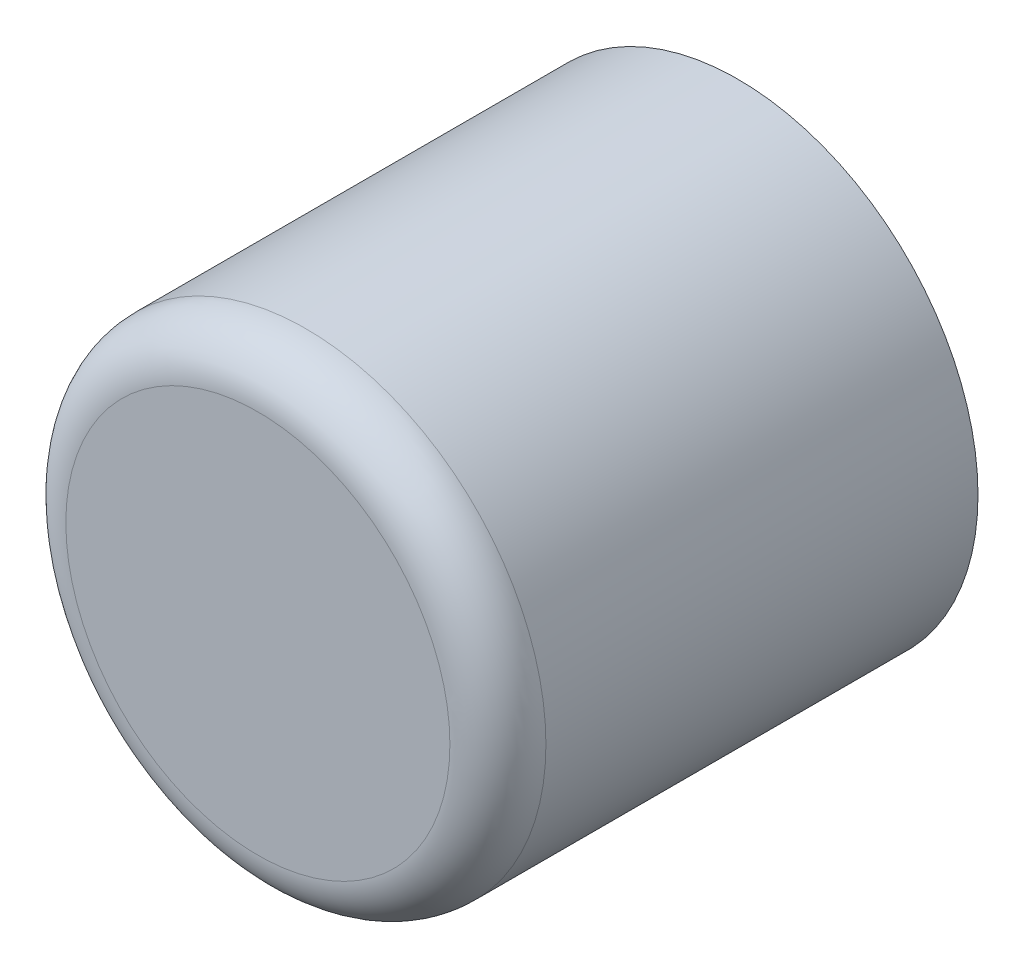
ISO-10303-21;
HEADER;
FILE_DESCRIPTION(('STEP AP214'),'2;1');
FILE_NAME('part.step','',(''),(''),'','','');
FILE_SCHEMA(('AUTOMOTIVE_DESIGN { 1 0 10303 214 1 1 1 1 }'));
ENDSEC;
DATA;
#1=APPLICATION_CONTEXT('core data for automotive mechanical design processes');
#2=APPLICATION_PROTOCOL_DEFINITION('international standard','automotive_design',2000,#1);
#3=PRODUCT_CONTEXT('',#1,'mechanical');
#4=PRODUCT('Part','Part','',(#3));
#5=PRODUCT_RELATED_PRODUCT_CATEGORY('part','',(#4));
#6=PRODUCT_DEFINITION_FORMATION('','',#4);
#7=PRODUCT_DEFINITION_CONTEXT('part definition',#1,'design');
#8=PRODUCT_DEFINITION('design','',#6,#7);
#9=PRODUCT_DEFINITION_SHAPE('','',#8);
#10=(LENGTH_UNIT() NAMED_UNIT(*) SI_UNIT(.MILLI.,.METRE.));
#11=(NAMED_UNIT(*) PLANE_ANGLE_UNIT() SI_UNIT($,.RADIAN.));
#12=(NAMED_UNIT(*) SI_UNIT($,.STERADIAN.) SOLID_ANGLE_UNIT());
#13=UNCERTAINTY_MEASURE_WITH_UNIT(LENGTH_MEASURE(1.E-05),#10,'distance_accuracy_value','');
#14=(GEOMETRIC_REPRESENTATION_CONTEXT(3) GLOBAL_UNCERTAINTY_ASSIGNED_CONTEXT((#13)) GLOBAL_UNIT_ASSIGNED_CONTEXT((#10,
#11,#12)) REPRESENTATION_CONTEXT('',''));
#15=CARTESIAN_POINT('',(0.,0.,0.));
#16=DIRECTION('',(0.,0.,1.));
#17=DIRECTION('',(1.,0.,0.));
#18=AXIS2_PLACEMENT_3D('',#15,#16,#17);
#19=CARTESIAN_POINT('',(0.,0.,20.));
#20=DIRECTION('',(0.,0.,-1.));
#21=DIRECTION('',(-1.,0.,0.));
#22=AXIS2_PLACEMENT_3D('',#19,#20,#21);
#23=CYLINDRICAL_SURFACE('',#22,10.);
#24=CARTESIAN_POINT('',(0.,0.,18.));
#25=DIRECTION('',(0.,0.,1.));
#26=DIRECTION('',(1.,0.,0.));
#27=AXIS2_PLACEMENT_3D('',#24,#25,#26);
#28=CIRCLE('',#27,10.);
#29=CARTESIAN_POINT('',(10.,0.,18.));
#30=VERTEX_POINT('',#29);
#31=EDGE_CURVE('E10',#30,#30,#28,.F.);
#32=ORIENTED_EDGE('',*,*,#31,.T.);
#33=EDGE_LOOP('',(#32));
#34=FACE_BOUND('',#33,.T.);
#35=CARTESIAN_POINT('',(0.,0.,0.));
#36=DIRECTION('',(0.,0.,1.));
#37=DIRECTION('',(1.,0.,0.));
#38=AXIS2_PLACEMENT_3D('',#35,#36,#37);
#39=CIRCLE('',#38,10.);
#40=CARTESIAN_POINT('',(10.,0.,0.));
#41=VERTEX_POINT('',#40);
#42=EDGE_CURVE('E52',#41,#41,#39,.T.);
#43=ORIENTED_EDGE('',*,*,#42,.T.);
#44=EDGE_LOOP('',(#43));
#45=FACE_BOUND('',#44,.T.);
#46=ADVANCED_FACE('F41',(#34,#45),#23,.T.);
#47=CARTESIAN_POINT('',(0.,0.,20.));
#48=DIRECTION('',(0.,0.,1.));
#49=DIRECTION('',(1.,0.,0.));
#50=AXIS2_PLACEMENT_3D('',#47,#48,#49);
#51=PLANE('',#50);
#52=CARTESIAN_POINT('',(0.,0.,20.));
#53=DIRECTION('',(0.,0.,1.));
#54=DIRECTION('',(1.,0.,0.));
#55=AXIS2_PLACEMENT_3D('',#52,#53,#54);
#56=CIRCLE('',#55,8.);
#57=CARTESIAN_POINT('',(8.,0.,20.));
#58=VERTEX_POINT('',#57);
#59=EDGE_CURVE('E48',#58,#58,#56,.T.);
#60=ORIENTED_EDGE('',*,*,#59,.T.);
#61=EDGE_LOOP('',(#60));
#62=FACE_BOUND('',#61,.T.);
#63=ADVANCED_FACE('F62',(#62),#51,.T.);
#64=CARTESIAN_POINT('',(0.,0.,0.));
#65=DIRECTION('',(0.,0.,1.));
#66=DIRECTION('',(1.,0.,0.));
#67=AXIS2_PLACEMENT_3D('',#64,#65,#66);
#68=PLANE('',#67);
#69=ORIENTED_EDGE('',*,*,#42,.F.);
#70=EDGE_LOOP('',(#69));
#71=FACE_BOUND('',#70,.T.);
#72=ADVANCED_FACE('F60',(#71),#68,.F.);
#73=CARTESIAN_POINT('',(0.,0.,18.));
#74=DIRECTION('',(0.,0.,1.));
#75=DIRECTION('',(1.,0.,0.));
#76=AXIS2_PLACEMENT_3D('',#73,#74,#75);
#77=TOROIDAL_SURFACE('',#76,8.,2.);
#78=ORIENTED_EDGE('',*,*,#31,.F.);
#79=EDGE_LOOP('',(#78));
#80=FACE_BOUND('',#79,.T.);
#81=ORIENTED_EDGE('',*,*,#59,.F.);
#82=EDGE_LOOP('',(#81));
#83=FACE_BOUND('',#82,.T.);
#84=ADVANCED_FACE('F43',(#80,#83),#77,.T.);
#85=CLOSED_SHELL('',(#46,#63,#72,#84));
#86=MANIFOLD_SOLID_BREP('B2',#85);
#87=ADVANCED_BREP_SHAPE_REPRESENTATION('',(#18,#86),#14);
#88=SHAPE_DEFINITION_REPRESENTATION(#9,#87);
ENDSEC;
END-ISO-10303-21;
